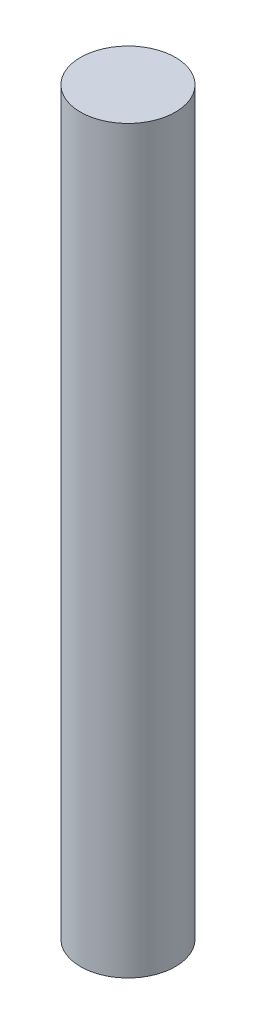
ISO-10303-21;
HEADER;
FILE_DESCRIPTION(('STEP AP214'),'2;1');
FILE_NAME('part.step','',(''),(''),'','','');
FILE_SCHEMA(('AUTOMOTIVE_DESIGN { 1 0 10303 214 1 1 1 1 }'));
ENDSEC;
DATA;
#1=APPLICATION_CONTEXT('core data for automotive mechanical design processes');
#2=APPLICATION_PROTOCOL_DEFINITION('international standard','automotive_design',2000,#1);
#3=PRODUCT_CONTEXT('',#1,'mechanical');
#4=PRODUCT('Part','Part','',(#3));
#5=PRODUCT_RELATED_PRODUCT_CATEGORY('part','',(#4));
#6=PRODUCT_DEFINITION_FORMATION('','',#4);
#7=PRODUCT_DEFINITION_CONTEXT('part definition',#1,'design');
#8=PRODUCT_DEFINITION('design','',#6,#7);
#9=PRODUCT_DEFINITION_SHAPE('','',#8);
#10=(LENGTH_UNIT() NAMED_UNIT(*) SI_UNIT(.MILLI.,.METRE.));
#11=(NAMED_UNIT(*) PLANE_ANGLE_UNIT() SI_UNIT($,.RADIAN.));
#12=(NAMED_UNIT(*) SI_UNIT($,.STERADIAN.) SOLID_ANGLE_UNIT());
#13=UNCERTAINTY_MEASURE_WITH_UNIT(LENGTH_MEASURE(1.E-05),#10,'distance_accuracy_value','');
#14=(GEOMETRIC_REPRESENTATION_CONTEXT(3) GLOBAL_UNCERTAINTY_ASSIGNED_CONTEXT((#13)) GLOBAL_UNIT_ASSIGNED_CONTEXT((#10,
#11,#12)) REPRESENTATION_CONTEXT('',''));
#15=CARTESIAN_POINT('',(0.,0.,0.));
#16=DIRECTION('',(0.,0.,1.));
#17=DIRECTION('',(1.,0.,0.));
#18=AXIS2_PLACEMENT_3D('',#15,#16,#17);
#19=CARTESIAN_POINT('',(0.,24.765,0.));
#20=DIRECTION('',(0.,-1.,0.));
#21=DIRECTION('',(0.,0.,-1.));
#22=AXIS2_PLACEMENT_3D('',#19,#20,#21);
#23=CYLINDRICAL_SURFACE('',#22,1.5875);
#24=CARTESIAN_POINT('',(0.,24.765,0.));
#25=DIRECTION('',(0.,1.,0.));
#26=DIRECTION('',(0.,0.,1.));
#27=AXIS2_PLACEMENT_3D('',#24,#25,#26);
#28=CIRCLE('',#27,1.5875);
#29=CARTESIAN_POINT('',(0.,24.765,1.5875));
#30=VERTEX_POINT('',#29);
#31=EDGE_CURVE('E10',#30,#30,#28,.T.);
#32=ORIENTED_EDGE('',*,*,#31,.F.);
#33=EDGE_LOOP('',(#32));
#34=FACE_BOUND('',#33,.T.);
#35=CARTESIAN_POINT('',(0.,0.,0.));
#36=DIRECTION('',(0.,1.,0.));
#37=DIRECTION('',(0.,0.,1.));
#38=AXIS2_PLACEMENT_3D('',#35,#36,#37);
#39=CIRCLE('',#38,1.5875);
#40=CARTESIAN_POINT('',(0.,0.,1.5875));
#41=VERTEX_POINT('',#40);
#42=EDGE_CURVE('E36',#41,#41,#39,.T.);
#43=ORIENTED_EDGE('',*,*,#42,.T.);
#44=EDGE_LOOP('',(#43));
#45=FACE_BOUND('',#44,.T.);
#46=ADVANCED_FACE('F33',(#34,#45),#23,.T.);
#47=CARTESIAN_POINT('',(0.,24.765,0.));
#48=DIRECTION('',(0.,1.,0.));
#49=DIRECTION('',(0.,0.,1.));
#50=AXIS2_PLACEMENT_3D('',#47,#48,#49);
#51=PLANE('',#50);
#52=ORIENTED_EDGE('',*,*,#31,.T.);
#53=EDGE_LOOP('',(#52));
#54=FACE_BOUND('',#53,.T.);
#55=ADVANCED_FACE('F48',(#54),#51,.T.);
#56=CARTESIAN_POINT('',(0.,0.,0.));
#57=DIRECTION('',(0.,1.,0.));
#58=DIRECTION('',(0.,0.,1.));
#59=AXIS2_PLACEMENT_3D('',#56,#57,#58);
#60=PLANE('',#59);
#61=ORIENTED_EDGE('',*,*,#42,.F.);
#62=EDGE_LOOP('',(#61));
#63=FACE_BOUND('',#62,.T.);
#64=ADVANCED_FACE('F46',(#63),#60,.F.);
#65=CLOSED_SHELL('',(#46,#55,#64));
#66=MANIFOLD_SOLID_BREP('B2',#65);
#67=ADVANCED_BREP_SHAPE_REPRESENTATION('',(#18,#66),#14);
#68=SHAPE_DEFINITION_REPRESENTATION(#9,#67);
ENDSEC;
END-ISO-10303-21;
